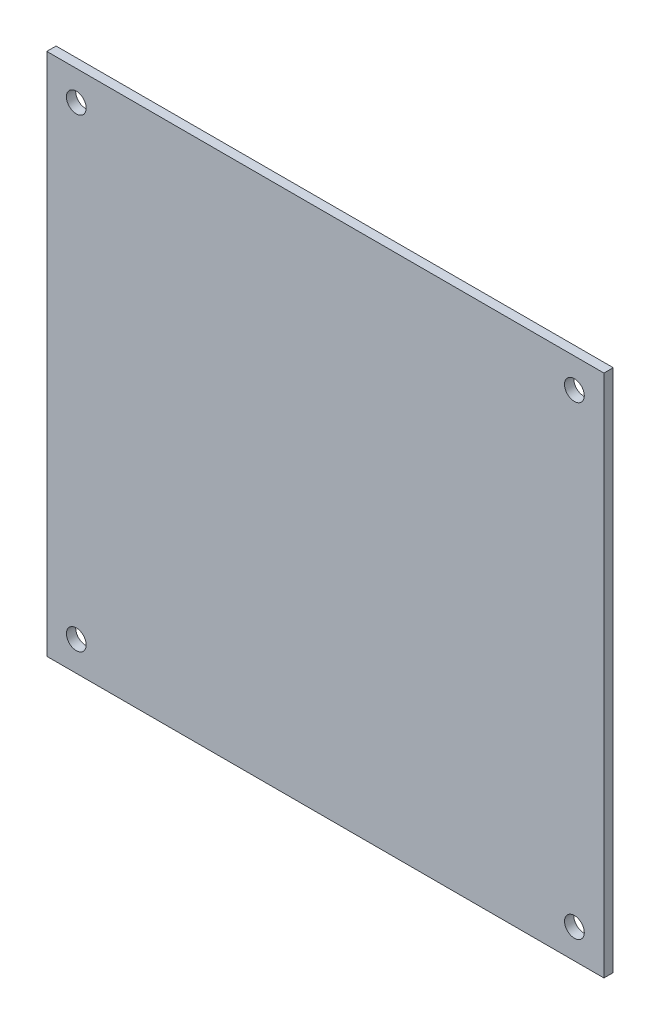
ISO-10303-21;
HEADER;
FILE_DESCRIPTION(('STEP AP214'),'2;1');
FILE_NAME('part.step','',(''),(''),'','','');
FILE_SCHEMA(('AUTOMOTIVE_DESIGN { 1 0 10303 214 1 1 1 1 }'));
ENDSEC;
DATA;
#1=APPLICATION_CONTEXT('core data for automotive mechanical design processes');
#2=APPLICATION_PROTOCOL_DEFINITION('international standard','automotive_design',2000,#1);
#3=PRODUCT_CONTEXT('',#1,'mechanical');
#4=PRODUCT('Part','Part','',(#3));
#5=PRODUCT_RELATED_PRODUCT_CATEGORY('part','',(#4));
#6=PRODUCT_DEFINITION_FORMATION('','',#4);
#7=PRODUCT_DEFINITION_CONTEXT('part definition',#1,'design');
#8=PRODUCT_DEFINITION('design','',#6,#7);
#9=PRODUCT_DEFINITION_SHAPE('','',#8);
#10=(LENGTH_UNIT() NAMED_UNIT(*) SI_UNIT(.MILLI.,.METRE.));
#11=(NAMED_UNIT(*) PLANE_ANGLE_UNIT() SI_UNIT($,.RADIAN.));
#12=(NAMED_UNIT(*) SI_UNIT($,.STERADIAN.) SOLID_ANGLE_UNIT());
#13=UNCERTAINTY_MEASURE_WITH_UNIT(LENGTH_MEASURE(1.E-05),#10,'distance_accuracy_value','');
#14=(GEOMETRIC_REPRESENTATION_CONTEXT(3) GLOBAL_UNCERTAINTY_ASSIGNED_CONTEXT((#13)) GLOBAL_UNIT_ASSIGNED_CONTEXT((#10,
#11,#12)) REPRESENTATION_CONTEXT('',''));
#15=CARTESIAN_POINT('',(0.,0.,0.));
#16=DIRECTION('',(0.,0.,1.));
#17=DIRECTION('',(1.,0.,0.));
#18=AXIS2_PLACEMENT_3D('',#15,#16,#17);
#19=CARTESIAN_POINT('',(0.,0.,1.6));
#20=DIRECTION('',(1.,0.,0.));
#21=DIRECTION('',(0.,0.,-1.));
#22=AXIS2_PLACEMENT_3D('',#19,#20,#21);
#23=PLANE('',#22);
#24=DIRECTION('',(0.,-1.,0.));
#25=VECTOR('',#24,1.);
#26=CARTESIAN_POINT('',(0.,0.,0.));
#27=LINE('',#26,#25);
#28=CARTESIAN_POINT('',(0.,90.17,0.));
#29=VERTEX_POINT('',#28);
#30=CARTESIAN_POINT('',(0.,0.,0.));
#31=VERTEX_POINT('',#30);
#32=EDGE_CURVE('E106',#29,#31,#27,.T.);
#33=ORIENTED_EDGE('',*,*,#32,.T.);
#34=DIRECTION('',(0.,0.,-1.));
#35=VECTOR('',#34,1.);
#36=CARTESIAN_POINT('',(0.,0.,1.6));
#37=LINE('',#36,#35);
#38=CARTESIAN_POINT('',(0.,0.,1.6));
#39=VERTEX_POINT('',#38);
#40=EDGE_CURVE('E11',#39,#31,#37,.T.);
#41=ORIENTED_EDGE('',*,*,#40,.F.);
#42=DIRECTION('',(0.,-1.,0.));
#43=VECTOR('',#42,1.);
#44=CARTESIAN_POINT('',(0.,0.,1.6));
#45=LINE('',#44,#43);
#46=CARTESIAN_POINT('',(0.,90.17,1.6));
#47=VERTEX_POINT('',#46);
#48=EDGE_CURVE('E93',#47,#39,#45,.T.);
#49=ORIENTED_EDGE('',*,*,#48,.F.);
#50=DIRECTION('',(0.,0.,-1.));
#51=VECTOR('',#50,1.);
#52=CARTESIAN_POINT('',(0.,90.17,1.6));
#53=LINE('',#52,#51);
#54=EDGE_CURVE('E102',#47,#29,#53,.T.);
#55=ORIENTED_EDGE('',*,*,#54,.T.);
#56=EDGE_LOOP('',(#33,#41,#49,#55));
#57=FACE_BOUND('',#56,.T.);
#58=ADVANCED_FACE('F40',(#57),#23,.F.);
#59=CARTESIAN_POINT('',(0.,0.,1.6));
#60=DIRECTION('',(0.,1.,0.));
#61=DIRECTION('',(0.,0.,1.));
#62=AXIS2_PLACEMENT_3D('',#59,#60,#61);
#63=PLANE('',#62);
#64=DIRECTION('',(1.,0.,0.));
#65=VECTOR('',#64,1.);
#66=CARTESIAN_POINT('',(0.,0.,0.));
#67=LINE('',#66,#65);
#68=CARTESIAN_POINT('',(95.89,0.,0.));
#69=VERTEX_POINT('',#68);
#70=EDGE_CURVE('E97',#31,#69,#67,.T.);
#71=ORIENTED_EDGE('',*,*,#70,.T.);
#72=DIRECTION('',(0.,0.,-1.));
#73=VECTOR('',#72,1.);
#74=CARTESIAN_POINT('',(95.89,0.,1.6));
#75=LINE('',#74,#73);
#76=CARTESIAN_POINT('',(95.89,0.,1.6));
#77=VERTEX_POINT('',#76);
#78=EDGE_CURVE('E49',#77,#69,#75,.T.);
#79=ORIENTED_EDGE('',*,*,#78,.F.);
#80=DIRECTION('',(1.,0.,0.));
#81=VECTOR('',#80,1.);
#82=CARTESIAN_POINT('',(0.,0.,1.6));
#83=LINE('',#82,#81);
#84=EDGE_CURVE('E88',#39,#77,#83,.T.);
#85=ORIENTED_EDGE('',*,*,#84,.F.);
#86=ORIENTED_EDGE('',*,*,#40,.T.);
#87=EDGE_LOOP('',(#71,#79,#85,#86));
#88=FACE_BOUND('',#87,.T.);
#89=ADVANCED_FACE('F96',(#88),#63,.F.);
#90=CARTESIAN_POINT('',(95.89,0.,1.6));
#91=DIRECTION('',(-1.,0.,0.));
#92=DIRECTION('',(0.,0.,1.));
#93=AXIS2_PLACEMENT_3D('',#90,#91,#92);
#94=PLANE('',#93);
#95=DIRECTION('',(0.,1.,0.));
#96=VECTOR('',#95,1.);
#97=CARTESIAN_POINT('',(95.89,0.,0.));
#98=LINE('',#97,#96);
#99=CARTESIAN_POINT('',(95.89,90.17,0.));
#100=VERTEX_POINT('',#99);
#101=EDGE_CURVE('E75',#69,#100,#98,.T.);
#102=ORIENTED_EDGE('',*,*,#101,.T.);
#103=DIRECTION('',(0.,0.,-1.));
#104=VECTOR('',#103,1.);
#105=CARTESIAN_POINT('',(95.89,90.17,1.6));
#106=LINE('',#105,#104);
#107=CARTESIAN_POINT('',(95.89,90.17,1.6));
#108=VERTEX_POINT('',#107);
#109=EDGE_CURVE('E98',#108,#100,#106,.T.);
#110=ORIENTED_EDGE('',*,*,#109,.F.);
#111=DIRECTION('',(0.,1.,0.));
#112=VECTOR('',#111,1.);
#113=CARTESIAN_POINT('',(95.89,0.,1.6));
#114=LINE('',#113,#112);
#115=EDGE_CURVE('E91',#77,#108,#114,.T.);
#116=ORIENTED_EDGE('',*,*,#115,.F.);
#117=ORIENTED_EDGE('',*,*,#78,.T.);
#118=EDGE_LOOP('',(#102,#110,#116,#117));
#119=FACE_BOUND('',#118,.T.);
#120=ADVANCED_FACE('F100',(#119),#94,.F.);
#121=CARTESIAN_POINT('',(0.,90.17,1.6));
#122=DIRECTION('',(0.,-1.,0.));
#123=DIRECTION('',(0.,0.,-1.));
#124=AXIS2_PLACEMENT_3D('',#121,#122,#123);
#125=PLANE('',#124);
#126=DIRECTION('',(-1.,0.,0.));
#127=VECTOR('',#126,1.);
#128=CARTESIAN_POINT('',(0.,90.17,0.));
#129=LINE('',#128,#127);
#130=EDGE_CURVE('E81',#100,#29,#129,.T.);
#131=ORIENTED_EDGE('',*,*,#130,.T.);
#132=ORIENTED_EDGE('',*,*,#54,.F.);
#133=DIRECTION('',(-1.,0.,0.));
#134=VECTOR('',#133,1.);
#135=CARTESIAN_POINT('',(0.,90.17,1.6));
#136=LINE('',#135,#134);
#137=EDGE_CURVE('E58',#108,#47,#136,.T.);
#138=ORIENTED_EDGE('',*,*,#137,.F.);
#139=ORIENTED_EDGE('',*,*,#109,.T.);
#140=EDGE_LOOP('',(#131,#132,#138,#139));
#141=FACE_BOUND('',#140,.T.);
#142=ADVANCED_FACE('F142',(#141),#125,.F.);
#143=CARTESIAN_POINT('',(0.,0.,1.6));
#144=DIRECTION('',(0.,0.,-1.));
#145=DIRECTION('',(-1.,0.,0.));
#146=AXIS2_PLACEMENT_3D('',#143,#144,#145);
#147=PLANE('',#146);
#148=CARTESIAN_POINT('',(90.81,5.08,1.6));
#149=DIRECTION('',(0.,0.,1.));
#150=DIRECTION('',(1.,0.,0.));
#151=AXIS2_PLACEMENT_3D('',#148,#149,#150);
#152=CIRCLE('',#151,1.69999999999999);
#153=CARTESIAN_POINT('',(92.51,5.08,1.6));
#154=VERTEX_POINT('',#153);
#155=EDGE_CURVE('E224',#154,#154,#152,.T.);
#156=ORIENTED_EDGE('',*,*,#155,.F.);
#157=EDGE_LOOP('',(#156));
#158=FACE_BOUND('',#157,.T.);
#159=CARTESIAN_POINT('',(5.08,85.09,1.6));
#160=DIRECTION('',(0.,0.,1.));
#161=DIRECTION('',(1.,0.,0.));
#162=AXIS2_PLACEMENT_3D('',#159,#160,#161);
#163=CIRCLE('',#162,1.7);
#164=CARTESIAN_POINT('',(6.78,85.09,1.6));
#165=VERTEX_POINT('',#164);
#166=EDGE_CURVE('E222',#165,#165,#163,.T.);
#167=ORIENTED_EDGE('',*,*,#166,.F.);
#168=EDGE_LOOP('',(#167));
#169=FACE_BOUND('',#168,.T.);
#170=CARTESIAN_POINT('',(90.81,85.09,1.6));
#171=DIRECTION('',(0.,0.,1.));
#172=DIRECTION('',(1.,0.,0.));
#173=AXIS2_PLACEMENT_3D('',#170,#171,#172);
#174=CIRCLE('',#173,1.69999999999999);
#175=CARTESIAN_POINT('',(92.51,85.09,1.6));
#176=VERTEX_POINT('',#175);
#177=EDGE_CURVE('E225',#176,#176,#174,.T.);
#178=ORIENTED_EDGE('',*,*,#177,.F.);
#179=EDGE_LOOP('',(#178));
#180=FACE_BOUND('',#179,.T.);
#181=CARTESIAN_POINT('',(5.08,5.08,1.6));
#182=DIRECTION('',(0.,0.,1.));
#183=DIRECTION('',(1.,0.,0.));
#184=AXIS2_PLACEMENT_3D('',#181,#182,#183);
#185=CIRCLE('',#184,1.7);
#186=CARTESIAN_POINT('',(6.78,5.08,1.6));
#187=VERTEX_POINT('',#186);
#188=EDGE_CURVE('E118',#187,#187,#185,.T.);
#189=ORIENTED_EDGE('',*,*,#188,.F.);
#190=EDGE_LOOP('',(#189));
#191=FACE_BOUND('',#190,.T.);
#192=ORIENTED_EDGE('',*,*,#48,.T.);
#193=ORIENTED_EDGE('',*,*,#84,.T.);
#194=ORIENTED_EDGE('',*,*,#115,.T.);
#195=ORIENTED_EDGE('',*,*,#137,.T.);
#196=EDGE_LOOP('',(#192,#193,#194,#195));
#197=FACE_BOUND('',#196,.T.);
#198=ADVANCED_FACE('F89',(#158,#169,#180,#191,#197),#147,.F.);
#199=CARTESIAN_POINT('',(0.,0.,0.));
#200=DIRECTION('',(0.,0.,-1.));
#201=DIRECTION('',(-1.,0.,0.));
#202=AXIS2_PLACEMENT_3D('',#199,#200,#201);
#203=PLANE('',#202);
#204=CARTESIAN_POINT('',(90.81,5.08,0.));
#205=DIRECTION('',(0.,0.,-1.));
#206=DIRECTION('',(-1.,0.,0.));
#207=AXIS2_PLACEMENT_3D('',#204,#205,#206);
#208=CIRCLE('',#207,1.69999999999999);
#209=CARTESIAN_POINT('',(92.51,5.08,0.));
#210=VERTEX_POINT('',#209);
#211=EDGE_CURVE('E43',#210,#210,#208,.T.);
#212=ORIENTED_EDGE('',*,*,#211,.F.);
#213=EDGE_LOOP('',(#212));
#214=FACE_BOUND('',#213,.T.);
#215=CARTESIAN_POINT('',(5.08,85.09,0.));
#216=DIRECTION('',(0.,0.,-1.));
#217=DIRECTION('',(-1.,0.,0.));
#218=AXIS2_PLACEMENT_3D('',#215,#216,#217);
#219=CIRCLE('',#218,1.7);
#220=CARTESIAN_POINT('',(6.78,85.09,0.));
#221=VERTEX_POINT('',#220);
#222=EDGE_CURVE('E120',#221,#221,#219,.T.);
#223=ORIENTED_EDGE('',*,*,#222,.F.);
#224=EDGE_LOOP('',(#223));
#225=FACE_BOUND('',#224,.T.);
#226=CARTESIAN_POINT('',(90.81,85.09,0.));
#227=DIRECTION('',(0.,0.,-1.));
#228=DIRECTION('',(-1.,0.,0.));
#229=AXIS2_PLACEMENT_3D('',#226,#227,#228);
#230=CIRCLE('',#229,1.69999999999999);
#231=CARTESIAN_POINT('',(92.51,85.09,0.));
#232=VERTEX_POINT('',#231);
#233=EDGE_CURVE('E117',#232,#232,#230,.T.);
#234=ORIENTED_EDGE('',*,*,#233,.F.);
#235=EDGE_LOOP('',(#234));
#236=FACE_BOUND('',#235,.T.);
#237=CARTESIAN_POINT('',(5.08,5.08,0.));
#238=DIRECTION('',(0.,0.,-1.));
#239=DIRECTION('',(-1.,0.,0.));
#240=AXIS2_PLACEMENT_3D('',#237,#238,#239);
#241=CIRCLE('',#240,1.7);
#242=CARTESIAN_POINT('',(6.78,5.08,0.));
#243=VERTEX_POINT('',#242);
#244=EDGE_CURVE('E114',#243,#243,#241,.T.);
#245=ORIENTED_EDGE('',*,*,#244,.F.);
#246=EDGE_LOOP('',(#245));
#247=FACE_BOUND('',#246,.T.);
#248=ORIENTED_EDGE('',*,*,#32,.F.);
#249=ORIENTED_EDGE('',*,*,#130,.F.);
#250=ORIENTED_EDGE('',*,*,#101,.F.);
#251=ORIENTED_EDGE('',*,*,#70,.F.);
#252=EDGE_LOOP('',(#248,#249,#250,#251));
#253=FACE_BOUND('',#252,.T.);
#254=ADVANCED_FACE('F130',(#214,#225,#236,#247,#253),#203,.T.);
#255=CARTESIAN_POINT('',(5.08,5.08,-1.2E-05));
#256=DIRECTION('',(0.,0.,1.));
#257=DIRECTION('',(1.,0.,0.));
#258=AXIS2_PLACEMENT_3D('',#255,#256,#257);
#259=CYLINDRICAL_SURFACE('',#258,1.7);
#260=CARTESIAN_POINT('',(6.78,5.08,0.));
#261=CARTESIAN_POINT('',(6.78,5.08,0.0166666666666667));
#262=CARTESIAN_POINT('',(6.78,5.08,0.0333333333333333));
#263=CARTESIAN_POINT('',(6.78,5.08,0.0666666666666667));
#264=CARTESIAN_POINT('',(6.78,5.08,0.0833333333333333));
#265=CARTESIAN_POINT('',(6.78,5.08,0.116666666666667));
#266=CARTESIAN_POINT('',(6.78,5.08,0.133333333333333));
#267=CARTESIAN_POINT('',(6.78,5.08,0.166666666666667));
#268=CARTESIAN_POINT('',(6.78,5.08,0.183333333333333));
#269=CARTESIAN_POINT('',(6.78,5.08,0.216666666666667));
#270=CARTESIAN_POINT('',(6.78,5.08,0.233333333333333));
#271=CARTESIAN_POINT('',(6.78,5.08,0.266666666666667));
#272=CARTESIAN_POINT('',(6.78,5.08,0.283333333333333));
#273=CARTESIAN_POINT('',(6.78,5.08,0.316666666666667));
#274=CARTESIAN_POINT('',(6.78,5.08,0.333333333333333));
#275=CARTESIAN_POINT('',(6.78,5.08,0.366666666666667));
#276=CARTESIAN_POINT('',(6.78,5.08,0.383333333333333));
#277=CARTESIAN_POINT('',(6.78,5.08,0.416666666666667));
#278=CARTESIAN_POINT('',(6.78,5.08,0.433333333333333));
#279=CARTESIAN_POINT('',(6.78,5.08,0.466666666666667));
#280=CARTESIAN_POINT('',(6.78,5.08,0.483333333333333));
#281=CARTESIAN_POINT('',(6.78,5.08,0.516666666666667));
#282=CARTESIAN_POINT('',(6.78,5.08,0.533333333333333));
#283=CARTESIAN_POINT('',(6.78,5.08,0.566666666666667));
#284=CARTESIAN_POINT('',(6.78,5.08,0.583333333333333));
#285=CARTESIAN_POINT('',(6.78,5.08,0.616666666666667));
#286=CARTESIAN_POINT('',(6.78,5.08,0.633333333333333));
#287=CARTESIAN_POINT('',(6.78,5.08,0.666666666666667));
#288=CARTESIAN_POINT('',(6.78,5.08,0.683333333333333));
#289=CARTESIAN_POINT('',(6.78,5.08,0.716666666666667));
#290=CARTESIAN_POINT('',(6.78,5.08,0.733333333333333));
#291=CARTESIAN_POINT('',(6.78,5.08,0.766666666666667));
#292=CARTESIAN_POINT('',(6.78,5.08,0.783333333333333));
#293=CARTESIAN_POINT('',(6.78,5.08,0.816666666666667));
#294=CARTESIAN_POINT('',(6.78,5.08,0.833333333333333));
#295=CARTESIAN_POINT('',(6.78,5.08,0.866666666666667));
#296=CARTESIAN_POINT('',(6.78,5.08,0.883333333333333));
#297=CARTESIAN_POINT('',(6.78,5.08,0.916666666666667));
#298=CARTESIAN_POINT('',(6.78,5.08,0.933333333333333));
#299=CARTESIAN_POINT('',(6.78,5.08,0.966666666666667));
#300=CARTESIAN_POINT('',(6.78,5.08,0.983333333333333));
#301=CARTESIAN_POINT('',(6.78,5.08,1.01666666666667));
#302=CARTESIAN_POINT('',(6.78,5.08,1.03333333333333));
#303=CARTESIAN_POINT('',(6.78,5.08,1.06666666666667));
#304=CARTESIAN_POINT('',(6.78,5.08,1.08333333333333));
#305=CARTESIAN_POINT('',(6.78,5.08,1.11666666666667));
#306=CARTESIAN_POINT('',(6.78,5.08,1.13333333333333));
#307=CARTESIAN_POINT('',(6.78,5.08,1.16666666666667));
#308=CARTESIAN_POINT('',(6.78,5.08,1.18333333333333));
#309=CARTESIAN_POINT('',(6.78,5.08,1.21666666666667));
#310=CARTESIAN_POINT('',(6.78,5.08,1.23333333333333));
#311=CARTESIAN_POINT('',(6.78,5.08,1.26666666666667));
#312=CARTESIAN_POINT('',(6.78,5.08,1.28333333333333));
#313=CARTESIAN_POINT('',(6.78,5.08,1.31666666666667));
#314=CARTESIAN_POINT('',(6.78,5.08,1.33333333333333));
#315=CARTESIAN_POINT('',(6.78,5.08,1.36666666666667));
#316=CARTESIAN_POINT('',(6.78,5.08,1.38333333333333));
#317=CARTESIAN_POINT('',(6.78,5.08,1.41666666666667));
#318=CARTESIAN_POINT('',(6.78,5.08,1.43333333333333));
#319=CARTESIAN_POINT('',(6.78,5.08,1.46666666666667));
#320=CARTESIAN_POINT('',(6.78,5.08,1.48333333333333));
#321=CARTESIAN_POINT('',(6.78,5.08,1.51666666666667));
#322=CARTESIAN_POINT('',(6.78,5.08,1.53333333333333));
#323=CARTESIAN_POINT('',(6.78,5.08,1.56666666666667));
#324=CARTESIAN_POINT('',(6.78,5.08,1.58333333333333));
#325=CARTESIAN_POINT('',(6.78,5.08,1.6));
#326=B_SPLINE_CURVE_WITH_KNOTS('',3,(#260,#261,#262,#263,#264,#265,#266,#267,#268,#269,#270,
#271,#272,#273,#274,#275,#276,#277,#278,#279,#280,#281,#282,#283,#284,#285,#286,#287,#288,#289,
#290,#291,#292,#293,#294,#295,#296,#297,#298,#299,#300,#301,#302,#303,#304,#305,#306,#307,#308,
#309,#310,#311,#312,#313,#314,#315,#316,#317,#318,#319,#320,#321,#322,#323,#324,#325),
.UNSPECIFIED.,.F.,.F.,(4,2,2,2,2,2,2,2,2,2,2,2,2,2,2,2,2,2,2,2,2,2,2,2,2,2,2,2,2,2,2,2,4),(0.,
0.05,0.1,0.15,0.2,0.25,0.3,0.35,0.4,0.45,0.5,0.55,0.6,0.65,0.7,0.75,0.8,0.85,0.9,0.95,1.,1.05,
1.1,1.15,1.2,1.25,1.3,1.35,1.4,1.45,1.5,1.55,1.6),.UNSPECIFIED.);
#327=EDGE_CURVE('BSEAM133',#243,#187,#326,.T.);
#328=ORIENTED_EDGE('',*,*,#244,.T.);
#329=ORIENTED_EDGE('',*,*,#188,.T.);
#330=ORIENTED_EDGE('',*,*,#327,.T.);
#331=ORIENTED_EDGE('',*,*,#327,.F.);
#332=EDGE_LOOP('',(#328,#330,#329,#331));
#333=FACE_BOUND('',#332,.T.);
#334=ADVANCED_FACE('F133',(#333),#259,.F.);
#335=CARTESIAN_POINT('',(90.81,85.09,-1.2E-05));
#336=DIRECTION('',(0.,0.,1.));
#337=DIRECTION('',(1.,0.,0.));
#338=AXIS2_PLACEMENT_3D('',#335,#336,#337);
#339=CYLINDRICAL_SURFACE('',#338,1.69999999999999);
#340=CARTESIAN_POINT('',(92.51,85.09,0.));
#341=CARTESIAN_POINT('',(92.51,85.09,0.0166666666666667));
#342=CARTESIAN_POINT('',(92.51,85.09,0.0333333333333333));
#343=CARTESIAN_POINT('',(92.51,85.09,0.0666666666666667));
#344=CARTESIAN_POINT('',(92.51,85.09,0.0833333333333333));
#345=CARTESIAN_POINT('',(92.51,85.09,0.116666666666667));
#346=CARTESIAN_POINT('',(92.51,85.09,0.133333333333333));
#347=CARTESIAN_POINT('',(92.51,85.09,0.166666666666667));
#348=CARTESIAN_POINT('',(92.51,85.09,0.183333333333333));
#349=CARTESIAN_POINT('',(92.51,85.09,0.216666666666667));
#350=CARTESIAN_POINT('',(92.51,85.09,0.233333333333333));
#351=CARTESIAN_POINT('',(92.51,85.09,0.266666666666667));
#352=CARTESIAN_POINT('',(92.51,85.09,0.283333333333333));
#353=CARTESIAN_POINT('',(92.51,85.09,0.316666666666667));
#354=CARTESIAN_POINT('',(92.51,85.09,0.333333333333333));
#355=CARTESIAN_POINT('',(92.51,85.09,0.366666666666667));
#356=CARTESIAN_POINT('',(92.51,85.09,0.383333333333333));
#357=CARTESIAN_POINT('',(92.51,85.09,0.416666666666667));
#358=CARTESIAN_POINT('',(92.51,85.09,0.433333333333333));
#359=CARTESIAN_POINT('',(92.51,85.09,0.466666666666667));
#360=CARTESIAN_POINT('',(92.51,85.09,0.483333333333333));
#361=CARTESIAN_POINT('',(92.51,85.09,0.516666666666667));
#362=CARTESIAN_POINT('',(92.51,85.09,0.533333333333333));
#363=CARTESIAN_POINT('',(92.51,85.09,0.566666666666667));
#364=CARTESIAN_POINT('',(92.51,85.09,0.583333333333333));
#365=CARTESIAN_POINT('',(92.51,85.09,0.616666666666667));
#366=CARTESIAN_POINT('',(92.51,85.09,0.633333333333333));
#367=CARTESIAN_POINT('',(92.51,85.09,0.666666666666667));
#368=CARTESIAN_POINT('',(92.51,85.09,0.683333333333333));
#369=CARTESIAN_POINT('',(92.51,85.09,0.716666666666667));
#370=CARTESIAN_POINT('',(92.51,85.09,0.733333333333333));
#371=CARTESIAN_POINT('',(92.51,85.09,0.766666666666667));
#372=CARTESIAN_POINT('',(92.51,85.09,0.783333333333333));
#373=CARTESIAN_POINT('',(92.51,85.09,0.816666666666667));
#374=CARTESIAN_POINT('',(92.51,85.09,0.833333333333333));
#375=CARTESIAN_POINT('',(92.51,85.09,0.866666666666667));
#376=CARTESIAN_POINT('',(92.51,85.09,0.883333333333333));
#377=CARTESIAN_POINT('',(92.51,85.09,0.916666666666667));
#378=CARTESIAN_POINT('',(92.51,85.09,0.933333333333333));
#379=CARTESIAN_POINT('',(92.51,85.09,0.966666666666667));
#380=CARTESIAN_POINT('',(92.51,85.09,0.983333333333333));
#381=CARTESIAN_POINT('',(92.51,85.09,1.01666666666667));
#382=CARTESIAN_POINT('',(92.51,85.09,1.03333333333333));
#383=CARTESIAN_POINT('',(92.51,85.09,1.06666666666667));
#384=CARTESIAN_POINT('',(92.51,85.09,1.08333333333333));
#385=CARTESIAN_POINT('',(92.51,85.09,1.11666666666667));
#386=CARTESIAN_POINT('',(92.51,85.09,1.13333333333333));
#387=CARTESIAN_POINT('',(92.51,85.09,1.16666666666667));
#388=CARTESIAN_POINT('',(92.51,85.09,1.18333333333333));
#389=CARTESIAN_POINT('',(92.51,85.09,1.21666666666667));
#390=CARTESIAN_POINT('',(92.51,85.09,1.23333333333333));
#391=CARTESIAN_POINT('',(92.51,85.09,1.26666666666667));
#392=CARTESIAN_POINT('',(92.51,85.09,1.28333333333333));
#393=CARTESIAN_POINT('',(92.51,85.09,1.31666666666667));
#394=CARTESIAN_POINT('',(92.51,85.09,1.33333333333333));
#395=CARTESIAN_POINT('',(92.51,85.09,1.36666666666667));
#396=CARTESIAN_POINT('',(92.51,85.09,1.38333333333333));
#397=CARTESIAN_POINT('',(92.51,85.09,1.41666666666667));
#398=CARTESIAN_POINT('',(92.51,85.09,1.43333333333333));
#399=CARTESIAN_POINT('',(92.51,85.09,1.46666666666667));
#400=CARTESIAN_POINT('',(92.51,85.09,1.48333333333333));
#401=CARTESIAN_POINT('',(92.51,85.09,1.51666666666667));
#402=CARTESIAN_POINT('',(92.51,85.09,1.53333333333333));
#403=CARTESIAN_POINT('',(92.51,85.09,1.56666666666667));
#404=CARTESIAN_POINT('',(92.51,85.09,1.58333333333333));
#405=CARTESIAN_POINT('',(92.51,85.09,1.6));
#406=B_SPLINE_CURVE_WITH_KNOTS('',3,(#340,#341,#342,#343,#344,#345,#346,#347,#348,#349,#350,
#351,#352,#353,#354,#355,#356,#357,#358,#359,#360,#361,#362,#363,#364,#365,#366,#367,#368,#369,
#370,#371,#372,#373,#374,#375,#376,#377,#378,#379,#380,#381,#382,#383,#384,#385,#386,#387,#388,
#389,#390,#391,#392,#393,#394,#395,#396,#397,#398,#399,#400,#401,#402,#403,#404,#405),
.UNSPECIFIED.,.F.,.F.,(4,2,2,2,2,2,2,2,2,2,2,2,2,2,2,2,2,2,2,2,2,2,2,2,2,2,2,2,2,2,2,2,4),(0.,
0.05,0.1,0.15,0.2,0.25,0.3,0.35,0.4,0.45,0.5,0.55,0.6,0.65,0.7,0.75,0.8,0.85,0.9,0.95,1.,1.05,
1.1,1.15,1.2,1.25,1.3,1.35,1.4,1.45,1.5,1.55,1.6),.UNSPECIFIED.);
#407=EDGE_CURVE('BSEAM189',#232,#176,#406,.T.);
#408=ORIENTED_EDGE('',*,*,#233,.T.);
#409=ORIENTED_EDGE('',*,*,#177,.T.);
#410=ORIENTED_EDGE('',*,*,#407,.T.);
#411=ORIENTED_EDGE('',*,*,#407,.F.);
#412=EDGE_LOOP('',(#408,#410,#409,#411));
#413=FACE_BOUND('',#412,.T.);
#414=ADVANCED_FACE('F189',(#413),#339,.F.);
#415=CARTESIAN_POINT('',(5.08,85.09,-1.2E-05));
#416=DIRECTION('',(0.,0.,1.));
#417=DIRECTION('',(1.,0.,0.));
#418=AXIS2_PLACEMENT_3D('',#415,#416,#417);
#419=CYLINDRICAL_SURFACE('',#418,1.7);
#420=CARTESIAN_POINT('',(6.78,85.09,0.));
#421=CARTESIAN_POINT('',(6.78,85.09,0.0166666666666667));
#422=CARTESIAN_POINT('',(6.78,85.09,0.0333333333333333));
#423=CARTESIAN_POINT('',(6.78,85.09,0.0666666666666667));
#424=CARTESIAN_POINT('',(6.78,85.09,0.0833333333333333));
#425=CARTESIAN_POINT('',(6.78,85.09,0.116666666666667));
#426=CARTESIAN_POINT('',(6.78,85.09,0.133333333333333));
#427=CARTESIAN_POINT('',(6.78,85.09,0.166666666666667));
#428=CARTESIAN_POINT('',(6.78,85.09,0.183333333333333));
#429=CARTESIAN_POINT('',(6.78,85.09,0.216666666666667));
#430=CARTESIAN_POINT('',(6.78,85.09,0.233333333333333));
#431=CARTESIAN_POINT('',(6.78,85.09,0.266666666666667));
#432=CARTESIAN_POINT('',(6.78,85.09,0.283333333333333));
#433=CARTESIAN_POINT('',(6.78,85.09,0.316666666666667));
#434=CARTESIAN_POINT('',(6.78,85.09,0.333333333333333));
#435=CARTESIAN_POINT('',(6.78,85.09,0.366666666666667));
#436=CARTESIAN_POINT('',(6.78,85.09,0.383333333333333));
#437=CARTESIAN_POINT('',(6.78,85.09,0.416666666666667));
#438=CARTESIAN_POINT('',(6.78,85.09,0.433333333333333));
#439=CARTESIAN_POINT('',(6.78,85.09,0.466666666666667));
#440=CARTESIAN_POINT('',(6.78,85.09,0.483333333333333));
#441=CARTESIAN_POINT('',(6.78,85.09,0.516666666666667));
#442=CARTESIAN_POINT('',(6.78,85.09,0.533333333333333));
#443=CARTESIAN_POINT('',(6.78,85.09,0.566666666666667));
#444=CARTESIAN_POINT('',(6.78,85.09,0.583333333333333));
#445=CARTESIAN_POINT('',(6.78,85.09,0.616666666666667));
#446=CARTESIAN_POINT('',(6.78,85.09,0.633333333333333));
#447=CARTESIAN_POINT('',(6.78,85.09,0.666666666666667));
#448=CARTESIAN_POINT('',(6.78,85.09,0.683333333333333));
#449=CARTESIAN_POINT('',(6.78,85.09,0.716666666666667));
#450=CARTESIAN_POINT('',(6.78,85.09,0.733333333333333));
#451=CARTESIAN_POINT('',(6.78,85.09,0.766666666666667));
#452=CARTESIAN_POINT('',(6.78,85.09,0.783333333333333));
#453=CARTESIAN_POINT('',(6.78,85.09,0.816666666666667));
#454=CARTESIAN_POINT('',(6.78,85.09,0.833333333333333));
#455=CARTESIAN_POINT('',(6.78,85.09,0.866666666666667));
#456=CARTESIAN_POINT('',(6.78,85.09,0.883333333333333));
#457=CARTESIAN_POINT('',(6.78,85.09,0.916666666666667));
#458=CARTESIAN_POINT('',(6.78,85.09,0.933333333333333));
#459=CARTESIAN_POINT('',(6.78,85.09,0.966666666666667));
#460=CARTESIAN_POINT('',(6.78,85.09,0.983333333333333));
#461=CARTESIAN_POINT('',(6.78,85.09,1.01666666666667));
#462=CARTESIAN_POINT('',(6.78,85.09,1.03333333333333));
#463=CARTESIAN_POINT('',(6.78,85.09,1.06666666666667));
#464=CARTESIAN_POINT('',(6.78,85.09,1.08333333333333));
#465=CARTESIAN_POINT('',(6.78,85.09,1.11666666666667));
#466=CARTESIAN_POINT('',(6.78,85.09,1.13333333333333));
#467=CARTESIAN_POINT('',(6.78,85.09,1.16666666666667));
#468=CARTESIAN_POINT('',(6.78,85.09,1.18333333333333));
#469=CARTESIAN_POINT('',(6.78,85.09,1.21666666666667));
#470=CARTESIAN_POINT('',(6.78,85.09,1.23333333333333));
#471=CARTESIAN_POINT('',(6.78,85.09,1.26666666666667));
#472=CARTESIAN_POINT('',(6.78,85.09,1.28333333333333));
#473=CARTESIAN_POINT('',(6.78,85.09,1.31666666666667));
#474=CARTESIAN_POINT('',(6.78,85.09,1.33333333333333));
#475=CARTESIAN_POINT('',(6.78,85.09,1.36666666666667));
#476=CARTESIAN_POINT('',(6.78,85.09,1.38333333333333));
#477=CARTESIAN_POINT('',(6.78,85.09,1.41666666666667));
#478=CARTESIAN_POINT('',(6.78,85.09,1.43333333333333));
#479=CARTESIAN_POINT('',(6.78,85.09,1.46666666666667));
#480=CARTESIAN_POINT('',(6.78,85.09,1.48333333333333));
#481=CARTESIAN_POINT('',(6.78,85.09,1.51666666666667));
#482=CARTESIAN_POINT('',(6.78,85.09,1.53333333333333));
#483=CARTESIAN_POINT('',(6.78,85.09,1.56666666666667));
#484=CARTESIAN_POINT('',(6.78,85.09,1.58333333333333));
#485=CARTESIAN_POINT('',(6.78,85.09,1.6));
#486=B_SPLINE_CURVE_WITH_KNOTS('',3,(#420,#421,#422,#423,#424,#425,#426,#427,#428,#429,#430,
#431,#432,#433,#434,#435,#436,#437,#438,#439,#440,#441,#442,#443,#444,#445,#446,#447,#448,#449,
#450,#451,#452,#453,#454,#455,#456,#457,#458,#459,#460,#461,#462,#463,#464,#465,#466,#467,#468,
#469,#470,#471,#472,#473,#474,#475,#476,#477,#478,#479,#480,#481,#482,#483,#484,#485),
.UNSPECIFIED.,.F.,.F.,(4,2,2,2,2,2,2,2,2,2,2,2,2,2,2,2,2,2,2,2,2,2,2,2,2,2,2,2,2,2,2,2,4),(0.,
0.05,0.1,0.15,0.2,0.25,0.3,0.35,0.4,0.45,0.5,0.55,0.6,0.65,0.7,0.75,0.8,0.85,0.9,0.95,1.,1.05,
1.1,1.15,1.2,1.25,1.3,1.35,1.4,1.45,1.5,1.55,1.6),.UNSPECIFIED.);
#487=EDGE_CURVE('BSEAM199',#221,#165,#486,.T.);
#488=ORIENTED_EDGE('',*,*,#222,.T.);
#489=ORIENTED_EDGE('',*,*,#166,.T.);
#490=ORIENTED_EDGE('',*,*,#487,.T.);
#491=ORIENTED_EDGE('',*,*,#487,.F.);
#492=EDGE_LOOP('',(#488,#490,#489,#491));
#493=FACE_BOUND('',#492,.T.);
#494=ADVANCED_FACE('F199',(#493),#419,.F.);
#495=CARTESIAN_POINT('',(90.81,5.08,-1.2E-05));
#496=DIRECTION('',(0.,0.,1.));
#497=DIRECTION('',(1.,0.,0.));
#498=AXIS2_PLACEMENT_3D('',#495,#496,#497);
#499=CYLINDRICAL_SURFACE('',#498,1.69999999999999);
#500=CARTESIAN_POINT('',(92.51,5.08,0.));
#501=CARTESIAN_POINT('',(92.51,5.08,0.0166666666666667));
#502=CARTESIAN_POINT('',(92.51,5.08,0.0333333333333333));
#503=CARTESIAN_POINT('',(92.51,5.08,0.0666666666666667));
#504=CARTESIAN_POINT('',(92.51,5.08,0.0833333333333333));
#505=CARTESIAN_POINT('',(92.51,5.08,0.116666666666667));
#506=CARTESIAN_POINT('',(92.51,5.08,0.133333333333333));
#507=CARTESIAN_POINT('',(92.51,5.08,0.166666666666667));
#508=CARTESIAN_POINT('',(92.51,5.08,0.183333333333333));
#509=CARTESIAN_POINT('',(92.51,5.08,0.216666666666667));
#510=CARTESIAN_POINT('',(92.51,5.08,0.233333333333333));
#511=CARTESIAN_POINT('',(92.51,5.08,0.266666666666667));
#512=CARTESIAN_POINT('',(92.51,5.08,0.283333333333333));
#513=CARTESIAN_POINT('',(92.51,5.08,0.316666666666667));
#514=CARTESIAN_POINT('',(92.51,5.08,0.333333333333333));
#515=CARTESIAN_POINT('',(92.51,5.08,0.366666666666667));
#516=CARTESIAN_POINT('',(92.51,5.08,0.383333333333333));
#517=CARTESIAN_POINT('',(92.51,5.08,0.416666666666667));
#518=CARTESIAN_POINT('',(92.51,5.08,0.433333333333333));
#519=CARTESIAN_POINT('',(92.51,5.08,0.466666666666667));
#520=CARTESIAN_POINT('',(92.51,5.08,0.483333333333333));
#521=CARTESIAN_POINT('',(92.51,5.08,0.516666666666667));
#522=CARTESIAN_POINT('',(92.51,5.08,0.533333333333333));
#523=CARTESIAN_POINT('',(92.51,5.08,0.566666666666667));
#524=CARTESIAN_POINT('',(92.51,5.08,0.583333333333333));
#525=CARTESIAN_POINT('',(92.51,5.08,0.616666666666667));
#526=CARTESIAN_POINT('',(92.51,5.08,0.633333333333333));
#527=CARTESIAN_POINT('',(92.51,5.08,0.666666666666667));
#528=CARTESIAN_POINT('',(92.51,5.08,0.683333333333333));
#529=CARTESIAN_POINT('',(92.51,5.08,0.716666666666667));
#530=CARTESIAN_POINT('',(92.51,5.08,0.733333333333333));
#531=CARTESIAN_POINT('',(92.51,5.08,0.766666666666667));
#532=CARTESIAN_POINT('',(92.51,5.08,0.783333333333333));
#533=CARTESIAN_POINT('',(92.51,5.08,0.816666666666667));
#534=CARTESIAN_POINT('',(92.51,5.08,0.833333333333333));
#535=CARTESIAN_POINT('',(92.51,5.08,0.866666666666667));
#536=CARTESIAN_POINT('',(92.51,5.08,0.883333333333333));
#537=CARTESIAN_POINT('',(92.51,5.08,0.916666666666667));
#538=CARTESIAN_POINT('',(92.51,5.08,0.933333333333333));
#539=CARTESIAN_POINT('',(92.51,5.08,0.966666666666667));
#540=CARTESIAN_POINT('',(92.51,5.08,0.983333333333333));
#541=CARTESIAN_POINT('',(92.51,5.08,1.01666666666667));
#542=CARTESIAN_POINT('',(92.51,5.08,1.03333333333333));
#543=CARTESIAN_POINT('',(92.51,5.08,1.06666666666667));
#544=CARTESIAN_POINT('',(92.51,5.08,1.08333333333333));
#545=CARTESIAN_POINT('',(92.51,5.08,1.11666666666667));
#546=CARTESIAN_POINT('',(92.51,5.08,1.13333333333333));
#547=CARTESIAN_POINT('',(92.51,5.08,1.16666666666667));
#548=CARTESIAN_POINT('',(92.51,5.08,1.18333333333333));
#549=CARTESIAN_POINT('',(92.51,5.08,1.21666666666667));
#550=CARTESIAN_POINT('',(92.51,5.08,1.23333333333333));
#551=CARTESIAN_POINT('',(92.51,5.08,1.26666666666667));
#552=CARTESIAN_POINT('',(92.51,5.08,1.28333333333333));
#553=CARTESIAN_POINT('',(92.51,5.08,1.31666666666667));
#554=CARTESIAN_POINT('',(92.51,5.08,1.33333333333333));
#555=CARTESIAN_POINT('',(92.51,5.08,1.36666666666667));
#556=CARTESIAN_POINT('',(92.51,5.08,1.38333333333333));
#557=CARTESIAN_POINT('',(92.51,5.08,1.41666666666667));
#558=CARTESIAN_POINT('',(92.51,5.08,1.43333333333333));
#559=CARTESIAN_POINT('',(92.51,5.08,1.46666666666667));
#560=CARTESIAN_POINT('',(92.51,5.08,1.48333333333333));
#561=CARTESIAN_POINT('',(92.51,5.08,1.51666666666667));
#562=CARTESIAN_POINT('',(92.51,5.08,1.53333333333333));
#563=CARTESIAN_POINT('',(92.51,5.08,1.56666666666667));
#564=CARTESIAN_POINT('',(92.51,5.08,1.58333333333333));
#565=CARTESIAN_POINT('',(92.51,5.08,1.6));
#566=B_SPLINE_CURVE_WITH_KNOTS('',3,(#500,#501,#502,#503,#504,#505,#506,#507,#508,#509,#510,
#511,#512,#513,#514,#515,#516,#517,#518,#519,#520,#521,#522,#523,#524,#525,#526,#527,#528,#529,
#530,#531,#532,#533,#534,#535,#536,#537,#538,#539,#540,#541,#542,#543,#544,#545,#546,#547,#548,
#549,#550,#551,#552,#553,#554,#555,#556,#557,#558,#559,#560,#561,#562,#563,#564,#565),
.UNSPECIFIED.,.F.,.F.,(4,2,2,2,2,2,2,2,2,2,2,2,2,2,2,2,2,2,2,2,2,2,2,2,2,2,2,2,2,2,2,2,4),(0.,
0.05,0.1,0.15,0.2,0.25,0.3,0.35,0.4,0.45,0.5,0.55,0.6,0.65,0.7,0.75,0.8,0.85,0.9,0.95,1.,1.05,
1.1,1.15,1.2,1.25,1.3,1.35,1.4,1.45,1.5,1.55,1.6),.UNSPECIFIED.);
#567=EDGE_CURVE('BSEAM127',#210,#154,#566,.T.);
#568=ORIENTED_EDGE('',*,*,#211,.T.);
#569=ORIENTED_EDGE('',*,*,#155,.T.);
#570=ORIENTED_EDGE('',*,*,#567,.T.);
#571=ORIENTED_EDGE('',*,*,#567,.F.);
#572=EDGE_LOOP('',(#568,#570,#569,#571));
#573=FACE_BOUND('',#572,.T.);
#574=ADVANCED_FACE('F127',(#573),#499,.F.);
#575=CLOSED_SHELL('',(#58,#89,#120,#142,#198,#254,#334,#414,#494,#574));
#576=MANIFOLD_SOLID_BREP('B2',#575);
#577=ADVANCED_BREP_SHAPE_REPRESENTATION('',(#18,#576),#14);
#578=SHAPE_DEFINITION_REPRESENTATION(#9,#577);
ENDSEC;
END-ISO-10303-21;
